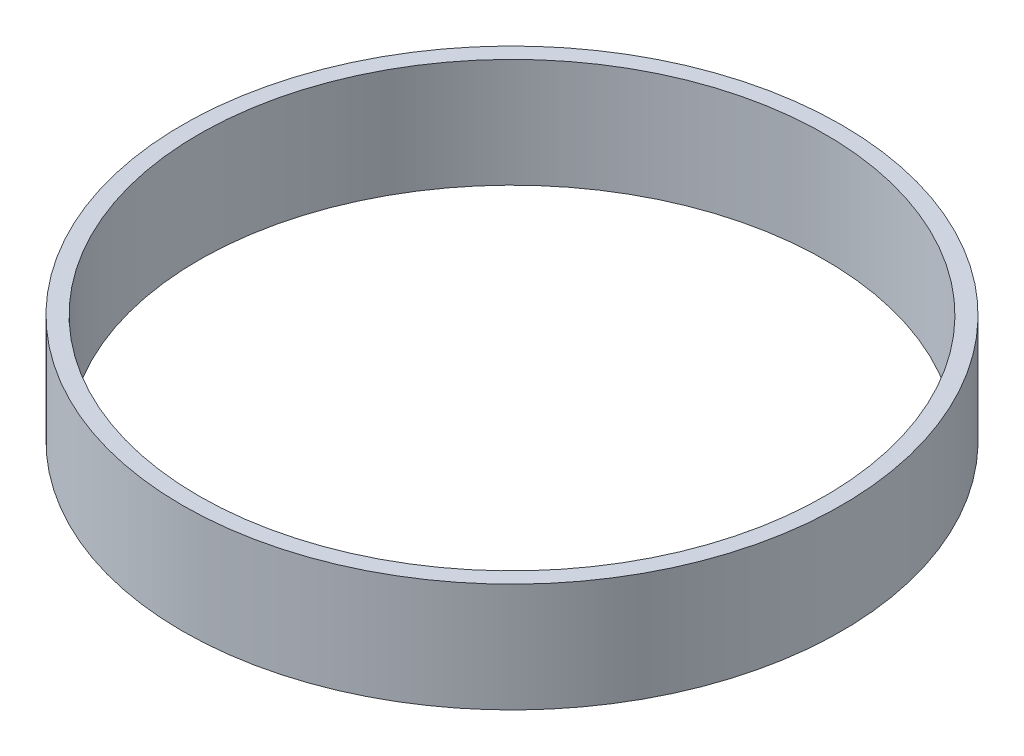
ISO-10303-21;
HEADER;
FILE_DESCRIPTION(('STEP AP214'),'2;1');
FILE_NAME('part.step','',(''),(''),'','','');
FILE_SCHEMA(('AUTOMOTIVE_DESIGN { 1 0 10303 214 1 1 1 1 }'));
ENDSEC;
DATA;
#1=APPLICATION_CONTEXT('core data for automotive mechanical design processes');
#2=APPLICATION_PROTOCOL_DEFINITION('international standard','automotive_design',2000,#1);
#3=PRODUCT_CONTEXT('',#1,'mechanical');
#4=PRODUCT('Part','Part','',(#3));
#5=PRODUCT_RELATED_PRODUCT_CATEGORY('part','',(#4));
#6=PRODUCT_DEFINITION_FORMATION('','',#4);
#7=PRODUCT_DEFINITION_CONTEXT('part definition',#1,'design');
#8=PRODUCT_DEFINITION('design','',#6,#7);
#9=PRODUCT_DEFINITION_SHAPE('','',#8);
#10=(LENGTH_UNIT() NAMED_UNIT(*) SI_UNIT(.MILLI.,.METRE.));
#11=(NAMED_UNIT(*) PLANE_ANGLE_UNIT() SI_UNIT($,.RADIAN.));
#12=(NAMED_UNIT(*) SI_UNIT($,.STERADIAN.) SOLID_ANGLE_UNIT());
#13=UNCERTAINTY_MEASURE_WITH_UNIT(LENGTH_MEASURE(1.E-05),#10,'distance_accuracy_value','');
#14=(GEOMETRIC_REPRESENTATION_CONTEXT(3) GLOBAL_UNCERTAINTY_ASSIGNED_CONTEXT((#13)) GLOBAL_UNIT_ASSIGNED_CONTEXT((#10,
#11,#12)) REPRESENTATION_CONTEXT('',''));
#15=CARTESIAN_POINT('',(0.,0.,0.));
#16=DIRECTION('',(0.,0.,1.));
#17=DIRECTION('',(1.,0.,0.));
#18=AXIS2_PLACEMENT_3D('',#15,#16,#17);
#19=CARTESIAN_POINT('',(0.,40.,0.));
#20=DIRECTION('',(0.,1.,0.));
#21=DIRECTION('',(0.,0.,1.));
#22=AXIS2_PLACEMENT_3D('',#19,#20,#21);
#23=PLANE('',#22);
#24=CARTESIAN_POINT('',(0.,40.,0.));
#25=DIRECTION('',(0.,1.,0.));
#26=DIRECTION('',(0.,0.,1.));
#27=AXIS2_PLACEMENT_3D('',#24,#25,#26);
#28=CIRCLE('',#27,121.);
#29=CARTESIAN_POINT('',(0.,40.,121.));
#30=VERTEX_POINT('',#29);
#31=EDGE_CURVE('E11',#30,#30,#28,.T.);
#32=ORIENTED_EDGE('',*,*,#31,.T.);
#33=EDGE_LOOP('',(#32));
#34=FACE_BOUND('',#33,.T.);
#35=CARTESIAN_POINT('',(0.,40.,0.));
#36=DIRECTION('',(0.,1.,0.));
#37=DIRECTION('',(0.,0.,1.));
#38=AXIS2_PLACEMENT_3D('',#35,#36,#37);
#39=CIRCLE('',#38,115.);
#40=CARTESIAN_POINT('',(0.,40.,115.));
#41=VERTEX_POINT('',#40);
#42=EDGE_CURVE('E111',#41,#41,#39,.T.);
#43=ORIENTED_EDGE('',*,*,#42,.F.);
#44=EDGE_LOOP('',(#43));
#45=FACE_BOUND('',#44,.T.);
#46=ADVANCED_FACE('F36',(#34,#45),#23,.T.);
#47=CARTESIAN_POINT('',(0.,0.,0.));
#48=DIRECTION('',(0.,1.,0.));
#49=DIRECTION('',(0.,0.,1.));
#50=AXIS2_PLACEMENT_3D('',#47,#48,#49);
#51=PLANE('',#50);
#52=CARTESIAN_POINT('',(118.,0.,-1.66533453693773E-13));
#53=DIRECTION('',(0.,1.,0.));
#54=DIRECTION('',(0.,0.,1.));
#55=AXIS2_PLACEMENT_3D('',#52,#53,#54);
#56=CIRCLE('',#55,2.75);
#57=CARTESIAN_POINT('',(118.,0.,2.74999999999983));
#58=VERTEX_POINT('',#57);
#59=EDGE_CURVE('E40',#58,#58,#56,.T.);
#60=ORIENTED_EDGE('',*,*,#59,.T.);
#61=EDGE_LOOP('',(#60));
#62=FACE_BOUND('',#61,.T.);
#63=CARTESIAN_POINT('',(83.4386001800126,0.,-83.4386001800126));
#64=DIRECTION('',(0.,1.,0.));
#65=DIRECTION('',(0.,0.,1.));
#66=AXIS2_PLACEMENT_3D('',#63,#64,#65);
#67=CIRCLE('',#66,2.75);
#68=CARTESIAN_POINT('',(83.4386001800126,0.,-80.6886001800126));
#69=VERTEX_POINT('',#68);
#70=EDGE_CURVE('E86',#69,#69,#67,.T.);
#71=ORIENTED_EDGE('',*,*,#70,.T.);
#72=EDGE_LOOP('',(#71));
#73=FACE_BOUND('',#72,.T.);
#74=CARTESIAN_POINT('',(0.,0.,-118.));
#75=DIRECTION('',(0.,1.,0.));
#76=DIRECTION('',(0.,0.,1.));
#77=AXIS2_PLACEMENT_3D('',#74,#75,#76);
#78=CIRCLE('',#77,2.75);
#79=CARTESIAN_POINT('',(0.,0.,-115.25));
#80=VERTEX_POINT('',#79);
#81=EDGE_CURVE('E90',#80,#80,#78,.T.);
#82=ORIENTED_EDGE('',*,*,#81,.T.);
#83=EDGE_LOOP('',(#82));
#84=FACE_BOUND('',#83,.T.);
#85=CARTESIAN_POINT('',(-83.4386001800125,0.,-83.4386001800127));
#86=DIRECTION('',(0.,1.,0.));
#87=DIRECTION('',(0.,0.,1.));
#88=AXIS2_PLACEMENT_3D('',#85,#86,#87);
#89=CIRCLE('',#88,2.75);
#90=CARTESIAN_POINT('',(-83.4386001800125,0.,-80.6886001800128));
#91=VERTEX_POINT('',#90);
#92=EDGE_CURVE('E94',#91,#91,#89,.T.);
#93=ORIENTED_EDGE('',*,*,#92,.T.);
#94=EDGE_LOOP('',(#93));
#95=FACE_BOUND('',#94,.T.);
#96=CARTESIAN_POINT('',(-118.,0.,-1.30104260698261E-13));
#97=DIRECTION('',(0.,1.,0.));
#98=DIRECTION('',(0.,0.,1.));
#99=AXIS2_PLACEMENT_3D('',#96,#97,#98);
#100=CIRCLE('',#99,2.75);
#101=CARTESIAN_POINT('',(-118.,0.,2.74999999999987));
#102=VERTEX_POINT('',#101);
#103=EDGE_CURVE('E98',#102,#102,#100,.T.);
#104=ORIENTED_EDGE('',*,*,#103,.T.);
#105=EDGE_LOOP('',(#104));
#106=FACE_BOUND('',#105,.T.);
#107=CARTESIAN_POINT('',(-83.4386001800127,0.,83.4386001800125));
#108=DIRECTION('',(0.,1.,0.));
#109=DIRECTION('',(0.,0.,1.));
#110=AXIS2_PLACEMENT_3D('',#107,#108,#109);
#111=CIRCLE('',#110,2.75);
#112=CARTESIAN_POINT('',(-83.4386001800127,0.,86.1886001800125));
#113=VERTEX_POINT('',#112);
#114=EDGE_CURVE('E102',#113,#113,#111,.T.);
#115=ORIENTED_EDGE('',*,*,#114,.T.);
#116=EDGE_LOOP('',(#115));
#117=FACE_BOUND('',#116,.T.);
#118=CARTESIAN_POINT('',(-1.11022302462516E-13,0.,118.));
#119=DIRECTION('',(0.,1.,0.));
#120=DIRECTION('',(0.,0.,1.));
#121=AXIS2_PLACEMENT_3D('',#118,#119,#120);
#122=CIRCLE('',#121,2.75);
#123=CARTESIAN_POINT('',(-1.11022302462516E-13,0.,120.75));
#124=VERTEX_POINT('',#123);
#125=EDGE_CURVE('E106',#124,#124,#122,.T.);
#126=ORIENTED_EDGE('',*,*,#125,.T.);
#127=EDGE_LOOP('',(#126));
#128=FACE_BOUND('',#127,.T.);
#129=CARTESIAN_POINT('',(83.4386001800125,0.,83.4386001800126));
#130=DIRECTION('',(0.,1.,0.));
#131=DIRECTION('',(0.,0.,1.));
#132=AXIS2_PLACEMENT_3D('',#129,#130,#131);
#133=CIRCLE('',#132,2.75);
#134=CARTESIAN_POINT('',(83.4386001800125,0.,86.1886001800126));
#135=VERTEX_POINT('',#134);
#136=EDGE_CURVE('E110',#135,#135,#133,.T.);
#137=ORIENTED_EDGE('',*,*,#136,.T.);
#138=EDGE_LOOP('',(#137));
#139=FACE_BOUND('',#138,.T.);
#140=CARTESIAN_POINT('',(0.,0.,0.));
#141=DIRECTION('',(0.,1.,0.));
#142=DIRECTION('',(0.,0.,1.));
#143=AXIS2_PLACEMENT_3D('',#140,#141,#142);
#144=CIRCLE('',#143,121.);
#145=CARTESIAN_POINT('',(0.,0.,121.));
#146=VERTEX_POINT('',#145);
#147=EDGE_CURVE('E45',#146,#146,#144,.T.);
#148=ORIENTED_EDGE('',*,*,#147,.F.);
#149=EDGE_LOOP('',(#148));
#150=FACE_BOUND('',#149,.T.);
#151=CARTESIAN_POINT('',(0.,0.,0.));
#152=DIRECTION('',(0.,1.,0.));
#153=DIRECTION('',(0.,0.,1.));
#154=AXIS2_PLACEMENT_3D('',#151,#152,#153);
#155=CIRCLE('',#154,115.);
#156=CARTESIAN_POINT('',(0.,0.,115.));
#157=VERTEX_POINT('',#156);
#158=EDGE_CURVE('E114',#157,#157,#155,.T.);
#159=ORIENTED_EDGE('',*,*,#158,.T.);
#160=EDGE_LOOP('',(#159));
#161=FACE_BOUND('',#160,.T.);
#162=ADVANCED_FACE('F133',(#62,#73,#84,#95,#106,#117,#128,#139,#150,#161),#51,.F.);
#163=CARTESIAN_POINT('',(0.,40.,0.));
#164=DIRECTION('',(0.,-1.,0.));
#165=DIRECTION('',(0.,0.,-1.));
#166=AXIS2_PLACEMENT_3D('',#163,#164,#165);
#167=CYLINDRICAL_SURFACE('',#166,121.);
#168=ORIENTED_EDGE('',*,*,#31,.F.);
#169=EDGE_LOOP('',(#168));
#170=FACE_BOUND('',#169,.T.);
#171=ORIENTED_EDGE('',*,*,#147,.T.);
#172=EDGE_LOOP('',(#171));
#173=FACE_BOUND('',#172,.T.);
#174=ADVANCED_FACE('F38',(#170,#173),#167,.T.);
#175=CARTESIAN_POINT('',(0.,40.,0.));
#176=DIRECTION('',(0.,-1.,0.));
#177=DIRECTION('',(0.,0.,-1.));
#178=AXIS2_PLACEMENT_3D('',#175,#176,#177);
#179=CYLINDRICAL_SURFACE('',#178,115.);
#180=ORIENTED_EDGE('',*,*,#42,.T.);
#181=EDGE_LOOP('',(#180));
#182=FACE_BOUND('',#181,.T.);
#183=ORIENTED_EDGE('',*,*,#158,.F.);
#184=EDGE_LOOP('',(#183));
#185=FACE_BOUND('',#184,.T.);
#186=ADVANCED_FACE('F161',(#182,#185),#179,.F.);
#187=CARTESIAN_POINT('',(83.4386001800125,-3.99999999999992,83.4386001800126));
#188=DIRECTION('',(0.,-1.,0.));
#189=DIRECTION('',(0.,0.,-1.));
#190=AXIS2_PLACEMENT_3D('',#187,#188,#189);
#191=CYLINDRICAL_SURFACE('',#190,2.75);
#192=CARTESIAN_POINT('',(83.4386001800125,16.0000000000001,83.4386001800126));
#193=DIRECTION('',(0.,-1.,0.));
#194=DIRECTION('',(0.,0.,-1.));
#195=AXIS2_PLACEMENT_3D('',#192,#193,#194);
#196=CIRCLE('',#195,2.74999999999999);
#197=CARTESIAN_POINT('',(83.4386001800125,16.0000000000001,80.6886001800126));
#198=VERTEX_POINT('',#197);
#199=EDGE_CURVE('E107',#198,#198,#196,.T.);
#200=ORIENTED_EDGE('',*,*,#199,.F.);
#201=EDGE_LOOP('',(#200));
#202=FACE_BOUND('',#201,.T.);
#203=ORIENTED_EDGE('',*,*,#136,.F.);
#204=EDGE_LOOP('',(#203));
#205=FACE_BOUND('',#204,.T.);
#206=ADVANCED_FACE('F164',(#202,#205),#191,.F.);
#207=CARTESIAN_POINT('',(83.4386001800125,16.0000000000001,83.4386001800126));
#208=DIRECTION('',(0.,-1.,0.));
#209=DIRECTION('',(0.,0.,-1.));
#210=AXIS2_PLACEMENT_3D('',#207,#208,#209);
#211=CONICAL_SURFACE('',#210,2.74999999999999,1.02974425867665);
#212=CARTESIAN_POINT('',(83.4386001800125,17.6523667023259,83.4386001800126));
#213=VERTEX_POINT('',#212);
#214=VERTEX_LOOP('',#213);
#215=FACE_BOUND('',#214,.T.);
#216=ORIENTED_EDGE('',*,*,#199,.T.);
#217=EDGE_LOOP('',(#216));
#218=FACE_BOUND('',#217,.T.);
#219=ADVANCED_FACE('F166',(#215,#218),#211,.F.);
#220=CARTESIAN_POINT('',(-1.11022302462516E-13,-3.99999999999992,118.));
#221=DIRECTION('',(0.,-1.,0.));
#222=DIRECTION('',(0.,0.,-1.));
#223=AXIS2_PLACEMENT_3D('',#220,#221,#222);
#224=CYLINDRICAL_SURFACE('',#223,2.75);
#225=CARTESIAN_POINT('',(-1.11022302462516E-13,16.0000000000001,118.));
#226=DIRECTION('',(0.,-1.,0.));
#227=DIRECTION('',(0.,0.,-1.));
#228=AXIS2_PLACEMENT_3D('',#225,#226,#227);
#229=CIRCLE('',#228,2.75);
#230=CARTESIAN_POINT('',(-1.11022302462516E-13,16.0000000000001,115.25));
#231=VERTEX_POINT('',#230);
#232=EDGE_CURVE('E103',#231,#231,#229,.T.);
#233=ORIENTED_EDGE('',*,*,#232,.F.);
#234=EDGE_LOOP('',(#233));
#235=FACE_BOUND('',#234,.T.);
#236=ORIENTED_EDGE('',*,*,#125,.F.);
#237=EDGE_LOOP('',(#236));
#238=FACE_BOUND('',#237,.T.);
#239=ADVANCED_FACE('F169',(#235,#238),#224,.F.);
#240=CARTESIAN_POINT('',(-1.11022302462516E-13,16.0000000000001,118.));
#241=DIRECTION('',(0.,-1.,0.));
#242=DIRECTION('',(0.,0.,-1.));
#243=AXIS2_PLACEMENT_3D('',#240,#241,#242);
#244=CONICAL_SURFACE('',#243,2.75,1.02974425867665);
#245=CARTESIAN_POINT('',(-1.16222912769196E-13,17.6523667023259,118.));
#246=VERTEX_POINT('',#245);
#247=VERTEX_LOOP('',#246);
#248=FACE_BOUND('',#247,.T.);
#249=ORIENTED_EDGE('',*,*,#232,.T.);
#250=EDGE_LOOP('',(#249));
#251=FACE_BOUND('',#250,.T.);
#252=ADVANCED_FACE('F173',(#248,#251),#244,.F.);
#253=CARTESIAN_POINT('',(-83.4386001800127,-3.99999999999993,83.4386001800125));
#254=DIRECTION('',(0.,-1.,0.));
#255=DIRECTION('',(0.,0.,-1.));
#256=AXIS2_PLACEMENT_3D('',#253,#254,#255);
#257=CYLINDRICAL_SURFACE('',#256,2.75);
#258=CARTESIAN_POINT('',(-83.4386001800127,16.0000000000001,83.4386001800125));
#259=DIRECTION('',(0.,-1.,0.));
#260=DIRECTION('',(0.,0.,-1.));
#261=AXIS2_PLACEMENT_3D('',#258,#259,#260);
#262=CIRCLE('',#261,2.74999999999999);
#263=CARTESIAN_POINT('',(-83.4386001800127,16.0000000000001,80.6886001800125));
#264=VERTEX_POINT('',#263);
#265=EDGE_CURVE('E99',#264,#264,#262,.T.);
#266=ORIENTED_EDGE('',*,*,#265,.F.);
#267=EDGE_LOOP('',(#266));
#268=FACE_BOUND('',#267,.T.);
#269=ORIENTED_EDGE('',*,*,#114,.F.);
#270=EDGE_LOOP('',(#269));
#271=FACE_BOUND('',#270,.T.);
#272=ADVANCED_FACE('F176',(#268,#271),#257,.F.);
#273=CARTESIAN_POINT('',(-83.4386001800127,16.0000000000001,83.4386001800125));
#274=DIRECTION('',(0.,-1.,0.));
#275=DIRECTION('',(0.,0.,-1.));
#276=AXIS2_PLACEMENT_3D('',#273,#274,#275);
#277=CONICAL_SURFACE('',#276,2.74999999999999,1.02974425867665);
#278=CARTESIAN_POINT('',(-83.4386001800127,17.6523667023259,83.4386001800125));
#279=VERTEX_POINT('',#278);
#280=VERTEX_LOOP('',#279);
#281=FACE_BOUND('',#280,.T.);
#282=ORIENTED_EDGE('',*,*,#265,.T.);
#283=EDGE_LOOP('',(#282));
#284=FACE_BOUND('',#283,.T.);
#285=ADVANCED_FACE('F180',(#281,#284),#277,.F.);
#286=CARTESIAN_POINT('',(-118.,-3.99999999999993,-1.30104260698261E-13));
#287=DIRECTION('',(0.,-1.,0.));
#288=DIRECTION('',(0.,0.,-1.));
#289=AXIS2_PLACEMENT_3D('',#286,#287,#288);
#290=CYLINDRICAL_SURFACE('',#289,2.75);
#291=CARTESIAN_POINT('',(-118.,16.0000000000001,-1.30104260698261E-13));
#292=DIRECTION('',(0.,-1.,0.));
#293=DIRECTION('',(0.,0.,-1.));
#294=AXIS2_PLACEMENT_3D('',#291,#292,#293);
#295=CIRCLE('',#294,2.74999999999999);
#296=CARTESIAN_POINT('',(-118.,16.0000000000001,-2.75000000000012));
#297=VERTEX_POINT('',#296);
#298=EDGE_CURVE('E95',#297,#297,#295,.T.);
#299=ORIENTED_EDGE('',*,*,#298,.F.);
#300=EDGE_LOOP('',(#299));
#301=FACE_BOUND('',#300,.T.);
#302=ORIENTED_EDGE('',*,*,#103,.F.);
#303=EDGE_LOOP('',(#302));
#304=FACE_BOUND('',#303,.T.);
#305=ADVANCED_FACE('F183',(#301,#304),#290,.F.);
#306=CARTESIAN_POINT('',(-118.,16.0000000000001,-1.30104260698261E-13));
#307=DIRECTION('',(0.,-1.,0.));
#308=DIRECTION('',(0.,0.,-1.));
#309=AXIS2_PLACEMENT_3D('',#306,#307,#308);
#310=CONICAL_SURFACE('',#309,2.74999999999999,1.02974425867665);
#311=CARTESIAN_POINT('',(-118.,17.6523667023259,-1.30104260698261E-13));
#312=VERTEX_POINT('',#311);
#313=VERTEX_LOOP('',#312);
#314=FACE_BOUND('',#313,.T.);
#315=ORIENTED_EDGE('',*,*,#298,.T.);
#316=EDGE_LOOP('',(#315));
#317=FACE_BOUND('',#316,.T.);
#318=ADVANCED_FACE('F188',(#314,#317),#310,.F.);
#319=CARTESIAN_POINT('',(-83.4386001800125,-3.99999999999992,-83.4386001800127));
#320=DIRECTION('',(0.,-1.,0.));
#321=DIRECTION('',(0.,0.,-1.));
#322=AXIS2_PLACEMENT_3D('',#319,#320,#321);
#323=CYLINDRICAL_SURFACE('',#322,2.75);
#324=CARTESIAN_POINT('',(-83.4386001800125,16.0000000000001,-83.4386001800127));
#325=DIRECTION('',(0.,-1.,0.));
#326=DIRECTION('',(0.,0.,-1.));
#327=AXIS2_PLACEMENT_3D('',#324,#325,#326);
#328=CIRCLE('',#327,2.74999999999999);
#329=CARTESIAN_POINT('',(-83.4386001800125,16.0000000000001,-86.1886001800127));
#330=VERTEX_POINT('',#329);
#331=EDGE_CURVE('E91',#330,#330,#328,.T.);
#332=ORIENTED_EDGE('',*,*,#331,.F.);
#333=EDGE_LOOP('',(#332));
#334=FACE_BOUND('',#333,.T.);
#335=ORIENTED_EDGE('',*,*,#92,.F.);
#336=EDGE_LOOP('',(#335));
#337=FACE_BOUND('',#336,.T.);
#338=ADVANCED_FACE('F191',(#334,#337),#323,.F.);
#339=CARTESIAN_POINT('',(-83.4386001800125,16.0000000000001,-83.4386001800127));
#340=DIRECTION('',(0.,-1.,0.));
#341=DIRECTION('',(0.,0.,-1.));
#342=AXIS2_PLACEMENT_3D('',#339,#340,#341);
#343=CONICAL_SURFACE('',#342,2.74999999999999,1.02974425867665);
#344=CARTESIAN_POINT('',(-83.4386001800125,17.6523667023259,-83.4386001800127));
#345=VERTEX_POINT('',#344);
#346=VERTEX_LOOP('',#345);
#347=FACE_BOUND('',#346,.T.);
#348=ORIENTED_EDGE('',*,*,#331,.T.);
#349=EDGE_LOOP('',(#348));
#350=FACE_BOUND('',#349,.T.);
#351=ADVANCED_FACE('F196',(#347,#350),#343,.F.);
#352=CARTESIAN_POINT('',(0.,-3.99999999999992,-118.));
#353=DIRECTION('',(0.,-1.,0.));
#354=DIRECTION('',(0.,0.,-1.));
#355=AXIS2_PLACEMENT_3D('',#352,#353,#354);
#356=CYLINDRICAL_SURFACE('',#355,2.75);
#357=CARTESIAN_POINT('',(0.,16.0000000000001,-118.));
#358=DIRECTION('',(0.,-1.,0.));
#359=DIRECTION('',(0.,0.,-1.));
#360=AXIS2_PLACEMENT_3D('',#357,#358,#359);
#361=CIRCLE('',#360,2.75);
#362=CARTESIAN_POINT('',(0.,16.0000000000001,-120.75));
#363=VERTEX_POINT('',#362);
#364=EDGE_CURVE('E87',#363,#363,#361,.T.);
#365=ORIENTED_EDGE('',*,*,#364,.F.);
#366=EDGE_LOOP('',(#365));
#367=FACE_BOUND('',#366,.T.);
#368=ORIENTED_EDGE('',*,*,#81,.F.);
#369=EDGE_LOOP('',(#368));
#370=FACE_BOUND('',#369,.T.);
#371=ADVANCED_FACE('F148',(#367,#370),#356,.F.);
#372=CARTESIAN_POINT('',(0.,16.0000000000001,-118.));
#373=DIRECTION('',(0.,-1.,0.));
#374=DIRECTION('',(0.,0.,-1.));
#375=AXIS2_PLACEMENT_3D('',#372,#373,#374);
#376=CONICAL_SURFACE('',#375,2.75,1.02974425867665);
#377=CARTESIAN_POINT('',(0.,17.6523667023259,-118.));
#378=VERTEX_POINT('',#377);
#379=VERTEX_LOOP('',#378);
#380=FACE_BOUND('',#379,.T.);
#381=ORIENTED_EDGE('',*,*,#364,.T.);
#382=EDGE_LOOP('',(#381));
#383=FACE_BOUND('',#382,.T.);
#384=ADVANCED_FACE('F139',(#380,#383),#376,.F.);
#385=CARTESIAN_POINT('',(83.4386001800126,-3.99999999999991,-83.4386001800126));
#386=DIRECTION('',(0.,-1.,0.));
#387=DIRECTION('',(0.,0.,-1.));
#388=AXIS2_PLACEMENT_3D('',#385,#386,#387);
#389=CYLINDRICAL_SURFACE('',#388,2.75);
#390=CARTESIAN_POINT('',(83.4386001800126,16.0000000000001,-83.4386001800126));
#391=DIRECTION('',(0.,-1.,0.));
#392=DIRECTION('',(0.,0.,-1.));
#393=AXIS2_PLACEMENT_3D('',#390,#391,#392);
#394=CIRCLE('',#393,2.74999999999999);
#395=CARTESIAN_POINT('',(83.4386001800126,16.0000000000001,-86.1886001800126));
#396=VERTEX_POINT('',#395);
#397=EDGE_CURVE('E82',#396,#396,#394,.T.);
#398=ORIENTED_EDGE('',*,*,#397,.F.);
#399=EDGE_LOOP('',(#398));
#400=FACE_BOUND('',#399,.T.);
#401=ORIENTED_EDGE('',*,*,#70,.F.);
#402=EDGE_LOOP('',(#401));
#403=FACE_BOUND('',#402,.T.);
#404=ADVANCED_FACE('F136',(#400,#403),#389,.F.);
#405=CARTESIAN_POINT('',(83.4386001800126,16.0000000000001,-83.4386001800126));
#406=DIRECTION('',(0.,-1.,0.));
#407=DIRECTION('',(0.,0.,-1.));
#408=AXIS2_PLACEMENT_3D('',#405,#406,#407);
#409=CONICAL_SURFACE('',#408,2.74999999999999,1.02974425867665);
#410=CARTESIAN_POINT('',(83.4386001800126,17.6523667023259,-83.4386001800126));
#411=VERTEX_POINT('',#410);
#412=VERTEX_LOOP('',#411);
#413=FACE_BOUND('',#412,.T.);
#414=ORIENTED_EDGE('',*,*,#397,.T.);
#415=EDGE_LOOP('',(#414));
#416=FACE_BOUND('',#415,.T.);
#417=ADVANCED_FACE('F138',(#413,#416),#409,.F.);
#418=CARTESIAN_POINT('',(118.,-3.99999999999991,-1.66533453693773E-13));
#419=DIRECTION('',(0.,-1.,0.));
#420=DIRECTION('',(0.,0.,-1.));
#421=AXIS2_PLACEMENT_3D('',#418,#419,#420);
#422=CYLINDRICAL_SURFACE('',#421,2.75);
#423=CARTESIAN_POINT('',(118.,16.0000000000001,-1.66533453693773E-13));
#424=DIRECTION('',(0.,-1.,0.));
#425=DIRECTION('',(0.,0.,-1.));
#426=AXIS2_PLACEMENT_3D('',#423,#424,#425);
#427=CIRCLE('',#426,2.74999999999999);
#428=CARTESIAN_POINT('',(118.,16.0000000000001,-2.75000000000015));
#429=VERTEX_POINT('',#428);
#430=EDGE_CURVE('E78',#429,#429,#427,.T.);
#431=ORIENTED_EDGE('',*,*,#430,.F.);
#432=EDGE_LOOP('',(#431));
#433=FACE_BOUND('',#432,.T.);
#434=ORIENTED_EDGE('',*,*,#59,.F.);
#435=EDGE_LOOP('',(#434));
#436=FACE_BOUND('',#435,.T.);
#437=ADVANCED_FACE('F74',(#433,#436),#422,.F.);
#438=CARTESIAN_POINT('',(118.,16.0000000000001,-1.66533453693773E-13));
#439=DIRECTION('',(0.,-1.,0.));
#440=DIRECTION('',(0.,0.,-1.));
#441=AXIS2_PLACEMENT_3D('',#438,#439,#440);
#442=CONICAL_SURFACE('',#441,2.74999999999999,1.02974425867665);
#443=CARTESIAN_POINT('',(118.,17.6523667023259,-1.66533453693773E-13));
#444=VERTEX_POINT('',#443);
#445=VERTEX_LOOP('',#444);
#446=FACE_BOUND('',#445,.T.);
#447=ORIENTED_EDGE('',*,*,#430,.T.);
#448=EDGE_LOOP('',(#447));
#449=FACE_BOUND('',#448,.T.);
#450=ADVANCED_FACE('F71',(#446,#449),#442,.F.);
#451=CLOSED_SHELL('',(#46,#162,#174,#186,#206,#219,#239,#252,#272,#285,#305,#318,#338,#351,#371,
#384,#404,#417,#437,#450));
#452=MANIFOLD_SOLID_BREP('B2',#451);
#453=ADVANCED_BREP_SHAPE_REPRESENTATION('',(#18,#452),#14);
#454=SHAPE_DEFINITION_REPRESENTATION(#9,#453);
ENDSEC;
END-ISO-10303-21;
